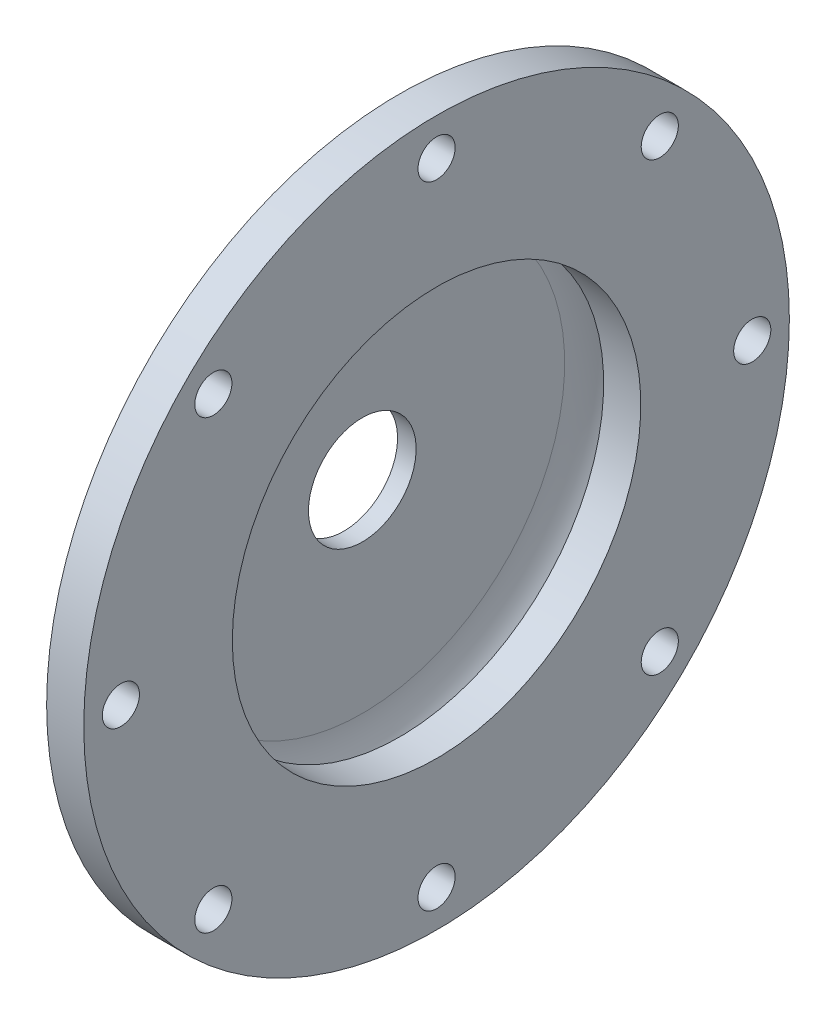
ISO-10303-21;
HEADER;
FILE_DESCRIPTION(('STEP AP214'),'2;1');
FILE_NAME('part.step','',(''),(''),'','','');
FILE_SCHEMA(('AUTOMOTIVE_DESIGN { 1 0 10303 214 1 1 1 1 }'));
ENDSEC;
DATA;
#1=APPLICATION_CONTEXT('core data for automotive mechanical design processes');
#2=APPLICATION_PROTOCOL_DEFINITION('international standard','automotive_design',2000,#1);
#3=PRODUCT_CONTEXT('',#1,'mechanical');
#4=PRODUCT('Part','Part','',(#3));
#5=PRODUCT_RELATED_PRODUCT_CATEGORY('part','',(#4));
#6=PRODUCT_DEFINITION_FORMATION('','',#4);
#7=PRODUCT_DEFINITION_CONTEXT('part definition',#1,'design');
#8=PRODUCT_DEFINITION('design','',#6,#7);
#9=PRODUCT_DEFINITION_SHAPE('','',#8);
#10=(LENGTH_UNIT() NAMED_UNIT(*) SI_UNIT(.MILLI.,.METRE.));
#11=(NAMED_UNIT(*) PLANE_ANGLE_UNIT() SI_UNIT($,.RADIAN.));
#12=(NAMED_UNIT(*) SI_UNIT($,.STERADIAN.) SOLID_ANGLE_UNIT());
#13=UNCERTAINTY_MEASURE_WITH_UNIT(LENGTH_MEASURE(1.E-05),#10,'distance_accuracy_value','');
#14=(GEOMETRIC_REPRESENTATION_CONTEXT(3) GLOBAL_UNCERTAINTY_ASSIGNED_CONTEXT((#13)) GLOBAL_UNIT_ASSIGNED_CONTEXT((#10,
#11,#12)) REPRESENTATION_CONTEXT('',''));
#15=CARTESIAN_POINT('',(0.,0.,0.));
#16=DIRECTION('',(0.,0.,1.));
#17=DIRECTION('',(1.,0.,0.));
#18=AXIS2_PLACEMENT_3D('',#15,#16,#17);
#19=CARTESIAN_POINT('',(4.13279166666667,0.,0.));
#20=DIRECTION('',(-1.,0.,0.));
#21=DIRECTION('',(0.,0.,1.));
#22=AXIS2_PLACEMENT_3D('',#19,#20,#21);
#23=TOROIDAL_SURFACE('',#22,34.6075,13.6577916666667);
#24=CARTESIAN_POINT('',(0.,0.,0.));
#25=DIRECTION('',(-1.,0.,0.));
#26=DIRECTION('',(0.,0.,1.));
#27=AXIS2_PLACEMENT_3D('',#24,#25,#26);
#28=CIRCLE('',#27,47.625);
#29=CARTESIAN_POINT('',(0.,0.,47.625));
#30=VERTEX_POINT('',#29);
#31=EDGE_CURVE('E93',#30,#30,#28,.T.);
#32=ORIENTED_EDGE('',*,*,#31,.T.);
#33=EDGE_LOOP('',(#32));
#34=FACE_BOUND('',#33,.T.);
#35=CARTESIAN_POINT('',(-9.52500000000001,0.,0.));
#36=DIRECTION('',(-1.,0.,0.));
#37=DIRECTION('',(0.,0.,1.));
#38=AXIS2_PLACEMENT_3D('',#35,#36,#37);
#39=CIRCLE('',#38,34.6075);
#40=CARTESIAN_POINT('',(-9.52500000000001,0.,34.6075));
#41=VERTEX_POINT('',#40);
#42=EDGE_CURVE('E10',#41,#41,#39,.T.);
#43=ORIENTED_EDGE('',*,*,#42,.F.);
#44=EDGE_LOOP('',(#43));
#45=FACE_BOUND('',#44,.T.);
#46=ADVANCED_FACE('F41',(#34,#45),#23,.T.);
#47=CARTESIAN_POINT('',(-9.525,0.,0.));
#48=DIRECTION('',(-1.,0.,0.));
#49=DIRECTION('',(0.,0.,1.));
#50=AXIS2_PLACEMENT_3D('',#47,#48,#49);
#51=PLANE('',#50);
#52=ORIENTED_EDGE('',*,*,#42,.T.);
#53=EDGE_LOOP('',(#52));
#54=FACE_BOUND('',#53,.T.);
#55=CARTESIAN_POINT('',(-9.52500000000001,0.,0.));
#56=DIRECTION('',(-1.,0.,0.));
#57=DIRECTION('',(0.,0.,1.));
#58=AXIS2_PLACEMENT_3D('',#55,#56,#57);
#59=CIRCLE('',#58,9.2075);
#60=CARTESIAN_POINT('',(-9.52500000000001,0.,9.2075));
#61=VERTEX_POINT('',#60);
#62=EDGE_CURVE('E49',#61,#61,#59,.T.);
#63=ORIENTED_EDGE('',*,*,#62,.F.);
#64=EDGE_LOOP('',(#63));
#65=FACE_BOUND('',#64,.T.);
#66=ADVANCED_FACE('F137',(#54,#65),#51,.T.);
#67=CARTESIAN_POINT('',(-978.52779400325,0.,0.));
#68=DIRECTION('',(-1.,0.,0.));
#69=DIRECTION('',(0.,0.,1.));
#70=AXIS2_PLACEMENT_3D('',#67,#68,#69);
#71=CYLINDRICAL_SURFACE('',#70,9.2075);
#72=ORIENTED_EDGE('',*,*,#62,.T.);
#73=EDGE_LOOP('',(#72));
#74=FACE_BOUND('',#73,.T.);
#75=CARTESIAN_POINT('',(-6.34999999999997,0.,0.));
#76=DIRECTION('',(-1.,0.,0.));
#77=DIRECTION('',(0.,0.,1.));
#78=AXIS2_PLACEMENT_3D('',#75,#76,#77);
#79=CIRCLE('',#78,9.2075);
#80=CARTESIAN_POINT('',(-6.34999999999997,0.,9.2075));
#81=VERTEX_POINT('',#80);
#82=EDGE_CURVE('E57',#81,#81,#79,.T.);
#83=ORIENTED_EDGE('',*,*,#82,.F.);
#84=EDGE_LOOP('',(#83));
#85=FACE_BOUND('',#84,.T.);
#86=ADVANCED_FACE('F135',(#74,#85),#71,.F.);
#87=CARTESIAN_POINT('',(-6.35,0.,0.));
#88=DIRECTION('',(1.,0.,0.));
#89=DIRECTION('',(0.,0.,-1.));
#90=AXIS2_PLACEMENT_3D('',#87,#88,#89);
#91=PLANE('',#90);
#92=ORIENTED_EDGE('',*,*,#82,.T.);
#93=EDGE_LOOP('',(#92));
#94=FACE_BOUND('',#93,.T.);
#95=CARTESIAN_POINT('',(-6.34999999999997,0.,0.));
#96=DIRECTION('',(-1.,0.,0.));
#97=DIRECTION('',(0.,0.,1.));
#98=AXIS2_PLACEMENT_3D('',#95,#96,#97);
#99=CIRCLE('',#98,34.6075);
#100=CARTESIAN_POINT('',(-6.34999999999997,0.,34.6075));
#101=VERTEX_POINT('',#100);
#102=EDGE_CURVE('E126',#101,#101,#99,.T.);
#103=ORIENTED_EDGE('',*,*,#102,.F.);
#104=EDGE_LOOP('',(#103));
#105=FACE_BOUND('',#104,.T.);
#106=ADVANCED_FACE('F132',(#94,#105),#91,.T.);
#107=CARTESIAN_POINT('',(4.45293750000002,0.,0.));
#108=DIRECTION('',(-1.,0.,0.));
#109=DIRECTION('',(0.,0.,1.));
#110=AXIS2_PLACEMENT_3D('',#107,#108,#109);
#111=TOROIDAL_SURFACE('',#110,34.6075,10.8029375);
#112=CARTESIAN_POINT('',(0.,0.,0.));
#113=DIRECTION('',(-1.,0.,0.));
#114=DIRECTION('',(0.,0.,1.));
#115=AXIS2_PLACEMENT_3D('',#112,#113,#114);
#116=CIRCLE('',#115,44.45);
#117=CARTESIAN_POINT('',(0.,0.,44.45));
#118=VERTEX_POINT('',#117);
#119=EDGE_CURVE('E123',#118,#118,#116,.T.);
#120=ORIENTED_EDGE('',*,*,#119,.F.);
#121=EDGE_LOOP('',(#120));
#122=FACE_BOUND('',#121,.T.);
#123=ORIENTED_EDGE('',*,*,#102,.T.);
#124=EDGE_LOOP('',(#123));
#125=FACE_BOUND('',#124,.T.);
#126=ADVANCED_FACE('F144',(#122,#125),#111,.F.);
#127=CARTESIAN_POINT('',(0.,0.,0.));
#128=DIRECTION('',(-1.,0.,0.));
#129=DIRECTION('',(0.,0.,1.));
#130=AXIS2_PLACEMENT_3D('',#127,#128,#129);
#131=PLANE('',#130);
#132=ORIENTED_EDGE('',*,*,#119,.T.);
#133=EDGE_LOOP('',(#132));
#134=FACE_BOUND('',#133,.T.);
#135=CARTESIAN_POINT('',(0.,0.,0.));
#136=DIRECTION('',(-1.,0.,0.));
#137=DIRECTION('',(0.,0.,1.));
#138=AXIS2_PLACEMENT_3D('',#135,#136,#137);
#139=CIRCLE('',#138,34.925);
#140=CARTESIAN_POINT('',(0.,0.,34.925));
#141=VERTEX_POINT('',#140);
#142=EDGE_CURVE('E119',#141,#141,#139,.T.);
#143=ORIENTED_EDGE('',*,*,#142,.F.);
#144=EDGE_LOOP('',(#143));
#145=FACE_BOUND('',#144,.T.);
#146=ADVANCED_FACE('F170',(#134,#145),#131,.T.);
#147=CARTESIAN_POINT('',(-978.52779400325,0.,0.));
#148=DIRECTION('',(-1.,0.,0.));
#149=DIRECTION('',(0.,0.,1.));
#150=AXIS2_PLACEMENT_3D('',#147,#148,#149);
#151=CYLINDRICAL_SURFACE('',#150,34.925);
#152=CARTESIAN_POINT('',(6.34999999999997,0.,0.));
#153=DIRECTION('',(-1.,0.,0.));
#154=DIRECTION('',(0.,0.,1.));
#155=AXIS2_PLACEMENT_3D('',#152,#153,#154);
#156=CIRCLE('',#155,34.925);
#157=CARTESIAN_POINT('',(6.34999999999997,0.,34.925));
#158=VERTEX_POINT('',#157);
#159=EDGE_CURVE('E115',#158,#158,#156,.T.);
#160=ORIENTED_EDGE('',*,*,#159,.F.);
#161=EDGE_LOOP('',(#160));
#162=FACE_BOUND('',#161,.T.);
#163=ORIENTED_EDGE('',*,*,#142,.T.);
#164=EDGE_LOOP('',(#163));
#165=FACE_BOUND('',#164,.T.);
#166=ADVANCED_FACE('F181',(#162,#165),#151,.F.);
#167=CARTESIAN_POINT('',(6.35,0.,0.));
#168=DIRECTION('',(-1.,0.,0.));
#169=DIRECTION('',(0.,0.,1.));
#170=AXIS2_PLACEMENT_3D('',#167,#168,#169);
#171=PLANE('',#170);
#172=CARTESIAN_POINT('',(6.34999999999997,53.975,0.));
#173=DIRECTION('',(-1.,0.,0.));
#174=DIRECTION('',(0.,0.,1.));
#175=AXIS2_PLACEMENT_3D('',#172,#173,#174);
#176=CIRCLE('',#175,3.175);
#177=CARTESIAN_POINT('',(6.34999999999997,53.975,3.175));
#178=VERTEX_POINT('',#177);
#179=EDGE_CURVE('E66',#178,#178,#176,.T.);
#180=ORIENTED_EDGE('',*,*,#179,.T.);
#181=EDGE_LOOP('',(#180));
#182=FACE_BOUND('',#181,.T.);
#183=CARTESIAN_POINT('',(6.34999999999997,38.1660885145439,38.1660885145439));
#184=DIRECTION('',(-1.,0.,0.));
#185=DIRECTION('',(0.,0.,1.));
#186=AXIS2_PLACEMENT_3D('',#183,#184,#185);
#187=CIRCLE('',#186,3.17500000000137);
#188=CARTESIAN_POINT('',(6.34999999999997,38.1660885145439,41.3410885145453));
#189=VERTEX_POINT('',#188);
#190=EDGE_CURVE('E329',#189,#189,#187,.T.);
#191=ORIENTED_EDGE('',*,*,#190,.T.);
#192=EDGE_LOOP('',(#191));
#193=FACE_BOUND('',#192,.T.);
#194=CARTESIAN_POINT('',(6.34999999999997,0.,53.975));
#195=DIRECTION('',(-1.,0.,0.));
#196=DIRECTION('',(0.,0.,1.));
#197=AXIS2_PLACEMENT_3D('',#194,#195,#196);
#198=CIRCLE('',#197,3.17500000000286);
#199=CARTESIAN_POINT('',(6.34999999999997,0.,57.1500000000029));
#200=VERTEX_POINT('',#199);
#201=EDGE_CURVE('E332',#200,#200,#198,.T.);
#202=ORIENTED_EDGE('',*,*,#201,.T.);
#203=EDGE_LOOP('',(#202));
#204=FACE_BOUND('',#203,.T.);
#205=CARTESIAN_POINT('',(6.34999999999997,-38.1660885145439,38.1660885145439));
#206=DIRECTION('',(-1.,0.,0.));
#207=DIRECTION('',(0.,0.,1.));
#208=AXIS2_PLACEMENT_3D('',#205,#206,#207);
#209=CIRCLE('',#208,3.17500000000421);
#210=CARTESIAN_POINT('',(6.34999999999997,-38.1660885145439,41.3410885145481));
#211=VERTEX_POINT('',#210);
#212=EDGE_CURVE('E338',#211,#211,#209,.T.);
#213=ORIENTED_EDGE('',*,*,#212,.T.);
#214=EDGE_LOOP('',(#213));
#215=FACE_BOUND('',#214,.T.);
#216=CARTESIAN_POINT('',(6.34999999999997,-53.975,0.));
#217=DIRECTION('',(-1.,0.,0.));
#218=DIRECTION('',(0.,0.,1.));
#219=AXIS2_PLACEMENT_3D('',#216,#217,#218);
#220=CIRCLE('',#219,3.17500000000437);
#221=CARTESIAN_POINT('',(6.34999999999997,-53.975,3.17500000000438));
#222=VERTEX_POINT('',#221);
#223=EDGE_CURVE('E342',#222,#222,#220,.T.);
#224=ORIENTED_EDGE('',*,*,#223,.T.);
#225=EDGE_LOOP('',(#224));
#226=FACE_BOUND('',#225,.T.);
#227=CARTESIAN_POINT('',(6.34999999999997,-38.1660885145439,-38.1660885145439));
#228=DIRECTION('',(-1.,0.,0.));
#229=DIRECTION('',(0.,0.,1.));
#230=AXIS2_PLACEMENT_3D('',#227,#228,#229);
#231=CIRCLE('',#230,3.17500000000326);
#232=CARTESIAN_POINT('',(6.34999999999997,-38.1660885145439,-34.9910885145407));
#233=VERTEX_POINT('',#232);
#234=EDGE_CURVE('E346',#233,#233,#231,.T.);
#235=ORIENTED_EDGE('',*,*,#234,.T.);
#236=EDGE_LOOP('',(#235));
#237=FACE_BOUND('',#236,.T.);
#238=CARTESIAN_POINT('',(6.34999999999997,0.,-53.975));
#239=DIRECTION('',(-1.,0.,0.));
#240=DIRECTION('',(0.,0.,1.));
#241=AXIS2_PLACEMENT_3D('',#238,#239,#240);
#242=CIRCLE('',#241,3.17500000000152);
#243=CARTESIAN_POINT('',(6.34999999999997,0.,-50.7999999999985));
#244=VERTEX_POINT('',#243);
#245=EDGE_CURVE('E349',#244,#244,#242,.T.);
#246=ORIENTED_EDGE('',*,*,#245,.T.);
#247=EDGE_LOOP('',(#246));
#248=FACE_BOUND('',#247,.T.);
#249=CARTESIAN_POINT('',(6.34999999999997,38.1660885145439,-38.1660885145439));
#250=DIRECTION('',(-1.,0.,0.));
#251=DIRECTION('',(0.,0.,1.));
#252=AXIS2_PLACEMENT_3D('',#249,#250,#251);
#253=CIRCLE('',#252,3.17500000000017);
#254=CARTESIAN_POINT('',(6.34999999999997,38.1660885145439,-34.9910885145438));
#255=VERTEX_POINT('',#254);
#256=EDGE_CURVE('E110',#255,#255,#253,.T.);
#257=ORIENTED_EDGE('',*,*,#256,.T.);
#258=EDGE_LOOP('',(#257));
#259=FACE_BOUND('',#258,.T.);
#260=CARTESIAN_POINT('',(6.34999999999997,0.,0.));
#261=DIRECTION('',(-1.,0.,0.));
#262=DIRECTION('',(0.,0.,1.));
#263=AXIS2_PLACEMENT_3D('',#260,#261,#262);
#264=CIRCLE('',#263,60.325);
#265=CARTESIAN_POINT('',(6.34999999999997,0.,60.325));
#266=VERTEX_POINT('',#265);
#267=EDGE_CURVE('E107',#266,#266,#264,.T.);
#268=ORIENTED_EDGE('',*,*,#267,.F.);
#269=EDGE_LOOP('',(#268));
#270=FACE_BOUND('',#269,.T.);
#271=ORIENTED_EDGE('',*,*,#159,.T.);
#272=EDGE_LOOP('',(#271));
#273=FACE_BOUND('',#272,.T.);
#274=ADVANCED_FACE('F178',(#182,#193,#204,#215,#226,#237,#248,#259,#270,#273),#171,.F.);
#275=CARTESIAN_POINT('',(-978.52779400325,0.,0.));
#276=DIRECTION('',(-1.,0.,0.));
#277=DIRECTION('',(0.,0.,1.));
#278=AXIS2_PLACEMENT_3D('',#275,#276,#277);
#279=CYLINDRICAL_SURFACE('',#278,60.325);
#280=ORIENTED_EDGE('',*,*,#267,.T.);
#281=EDGE_LOOP('',(#280));
#282=FACE_BOUND('',#281,.T.);
#283=CARTESIAN_POINT('',(0.,0.,0.));
#284=DIRECTION('',(-1.,0.,0.));
#285=DIRECTION('',(0.,0.,1.));
#286=AXIS2_PLACEMENT_3D('',#283,#284,#285);
#287=CIRCLE('',#286,60.325);
#288=CARTESIAN_POINT('',(0.,0.,60.325));
#289=VERTEX_POINT('',#288);
#290=EDGE_CURVE('E100',#289,#289,#287,.T.);
#291=ORIENTED_EDGE('',*,*,#290,.F.);
#292=EDGE_LOOP('',(#291));
#293=FACE_BOUND('',#292,.T.);
#294=ADVANCED_FACE('F167',(#282,#293),#279,.T.);
#295=CARTESIAN_POINT('',(0.,53.975,0.));
#296=DIRECTION('',(-1.,0.,0.));
#297=DIRECTION('',(0.,0.,1.));
#298=AXIS2_PLACEMENT_3D('',#295,#296,#297);
#299=CIRCLE('',#298,3.175);
#300=CARTESIAN_POINT('',(0.,53.975,3.175));
#301=VERTEX_POINT('',#300);
#302=EDGE_CURVE('E44',#301,#301,#299,.T.);
#303=ORIENTED_EDGE('',*,*,#302,.F.);
#304=EDGE_LOOP('',(#303));
#305=FACE_BOUND('',#304,.T.);
#306=CARTESIAN_POINT('',(0.,38.1660885145439,38.1660885145439));
#307=DIRECTION('',(-1.,0.,0.));
#308=DIRECTION('',(0.,0.,1.));
#309=AXIS2_PLACEMENT_3D('',#306,#307,#308);
#310=CIRCLE('',#309,3.17500000000137);
#311=CARTESIAN_POINT('',(0.,38.1660885145439,41.3410885145453));
#312=VERTEX_POINT('',#311);
#313=EDGE_CURVE('E84',#312,#312,#310,.T.);
#314=ORIENTED_EDGE('',*,*,#313,.F.);
#315=EDGE_LOOP('',(#314));
#316=FACE_BOUND('',#315,.T.);
#317=CARTESIAN_POINT('',(0.,0.,53.975));
#318=DIRECTION('',(-1.,0.,0.));
#319=DIRECTION('',(0.,0.,1.));
#320=AXIS2_PLACEMENT_3D('',#317,#318,#319);
#321=CIRCLE('',#320,3.17500000000286);
#322=CARTESIAN_POINT('',(0.,0.,57.1500000000029));
#323=VERTEX_POINT('',#322);
#324=EDGE_CURVE('E82',#323,#323,#321,.T.);
#325=ORIENTED_EDGE('',*,*,#324,.F.);
#326=EDGE_LOOP('',(#325));
#327=FACE_BOUND('',#326,.T.);
#328=CARTESIAN_POINT('',(0.,-38.1660885145439,38.1660885145439));
#329=DIRECTION('',(-1.,0.,0.));
#330=DIRECTION('',(0.,0.,1.));
#331=AXIS2_PLACEMENT_3D('',#328,#329,#330);
#332=CIRCLE('',#331,3.17500000000421);
#333=CARTESIAN_POINT('',(0.,-38.1660885145439,41.3410885145481));
#334=VERTEX_POINT('',#333);
#335=EDGE_CURVE('E78',#334,#334,#332,.T.);
#336=ORIENTED_EDGE('',*,*,#335,.F.);
#337=EDGE_LOOP('',(#336));
#338=FACE_BOUND('',#337,.T.);
#339=CARTESIAN_POINT('',(0.,-53.975,0.));
#340=DIRECTION('',(-1.,0.,0.));
#341=DIRECTION('',(0.,0.,1.));
#342=AXIS2_PLACEMENT_3D('',#339,#340,#341);
#343=CIRCLE('',#342,3.17500000000437);
#344=CARTESIAN_POINT('',(0.,-53.975,3.17500000000438));
#345=VERTEX_POINT('',#344);
#346=EDGE_CURVE('E74',#345,#345,#343,.T.);
#347=ORIENTED_EDGE('',*,*,#346,.F.);
#348=EDGE_LOOP('',(#347));
#349=FACE_BOUND('',#348,.T.);
#350=CARTESIAN_POINT('',(0.,-38.1660885145439,-38.1660885145439));
#351=DIRECTION('',(-1.,0.,0.));
#352=DIRECTION('',(0.,0.,1.));
#353=AXIS2_PLACEMENT_3D('',#350,#351,#352);
#354=CIRCLE('',#353,3.17500000000326);
#355=CARTESIAN_POINT('',(0.,-38.1660885145439,-34.9910885145407));
#356=VERTEX_POINT('',#355);
#357=EDGE_CURVE('E70',#356,#356,#354,.T.);
#358=ORIENTED_EDGE('',*,*,#357,.F.);
#359=EDGE_LOOP('',(#358));
#360=FACE_BOUND('',#359,.T.);
#361=CARTESIAN_POINT('',(0.,0.,-53.975));
#362=DIRECTION('',(-1.,0.,0.));
#363=DIRECTION('',(0.,0.,1.));
#364=AXIS2_PLACEMENT_3D('',#361,#362,#363);
#365=CIRCLE('',#364,3.17500000000152);
#366=CARTESIAN_POINT('',(0.,0.,-50.7999999999985));
#367=VERTEX_POINT('',#366);
#368=EDGE_CURVE('E65',#367,#367,#365,.T.);
#369=ORIENTED_EDGE('',*,*,#368,.F.);
#370=EDGE_LOOP('',(#369));
#371=FACE_BOUND('',#370,.T.);
#372=CARTESIAN_POINT('',(0.,38.1660885145439,-38.1660885145439));
#373=DIRECTION('',(-1.,0.,0.));
#374=DIRECTION('',(0.,0.,1.));
#375=AXIS2_PLACEMENT_3D('',#372,#373,#374);
#376=CIRCLE('',#375,3.17500000000017);
#377=CARTESIAN_POINT('',(0.,38.1660885145439,-34.9910885145438));
#378=VERTEX_POINT('',#377);
#379=EDGE_CURVE('E61',#378,#378,#376,.T.);
#380=ORIENTED_EDGE('',*,*,#379,.F.);
#381=EDGE_LOOP('',(#380));
#382=FACE_BOUND('',#381,.T.);
#383=ORIENTED_EDGE('',*,*,#290,.T.);
#384=EDGE_LOOP('',(#383));
#385=FACE_BOUND('',#384,.T.);
#386=ORIENTED_EDGE('',*,*,#31,.F.);
#387=EDGE_LOOP('',(#386));
#388=FACE_BOUND('',#387,.T.);
#389=ADVANCED_FACE('F162',(#305,#316,#327,#338,#349,#360,#371,#382,#385,#388),#131,.T.);
#390=CARTESIAN_POINT('',(6.34999999999997,38.1660885145439,-38.1660885145439));
#391=DIRECTION('',(-1.,0.,0.));
#392=DIRECTION('',(0.,0.,1.));
#393=AXIS2_PLACEMENT_3D('',#390,#391,#392);
#394=CYLINDRICAL_SURFACE('',#393,3.17500000000017);
#395=ORIENTED_EDGE('',*,*,#379,.T.);
#396=EDGE_LOOP('',(#395));
#397=FACE_BOUND('',#396,.T.);
#398=ORIENTED_EDGE('',*,*,#256,.F.);
#399=EDGE_LOOP('',(#398));
#400=FACE_BOUND('',#399,.T.);
#401=ADVANCED_FACE('F166',(#397,#400),#394,.F.);
#402=CARTESIAN_POINT('',(6.34999999999997,0.,-53.975));
#403=DIRECTION('',(-1.,0.,0.));
#404=DIRECTION('',(0.,0.,1.));
#405=AXIS2_PLACEMENT_3D('',#402,#403,#404);
#406=CYLINDRICAL_SURFACE('',#405,3.17500000000152);
#407=ORIENTED_EDGE('',*,*,#368,.T.);
#408=EDGE_LOOP('',(#407));
#409=FACE_BOUND('',#408,.T.);
#410=ORIENTED_EDGE('',*,*,#245,.F.);
#411=EDGE_LOOP('',(#410));
#412=FACE_BOUND('',#411,.T.);
#413=ADVANCED_FACE('F212',(#409,#412),#406,.F.);
#414=CARTESIAN_POINT('',(6.34999999999997,-38.1660885145439,-38.1660885145439));
#415=DIRECTION('',(-1.,0.,0.));
#416=DIRECTION('',(0.,0.,1.));
#417=AXIS2_PLACEMENT_3D('',#414,#415,#416);
#418=CYLINDRICAL_SURFACE('',#417,3.17500000000326);
#419=ORIENTED_EDGE('',*,*,#357,.T.);
#420=EDGE_LOOP('',(#419));
#421=FACE_BOUND('',#420,.T.);
#422=ORIENTED_EDGE('',*,*,#234,.F.);
#423=EDGE_LOOP('',(#422));
#424=FACE_BOUND('',#423,.T.);
#425=ADVANCED_FACE('F222',(#421,#424),#418,.F.);
#426=CARTESIAN_POINT('',(6.34999999999997,-53.975,0.));
#427=DIRECTION('',(-1.,0.,0.));
#428=DIRECTION('',(0.,0.,1.));
#429=AXIS2_PLACEMENT_3D('',#426,#427,#428);
#430=CYLINDRICAL_SURFACE('',#429,3.17500000000437);
#431=ORIENTED_EDGE('',*,*,#346,.T.);
#432=EDGE_LOOP('',(#431));
#433=FACE_BOUND('',#432,.T.);
#434=ORIENTED_EDGE('',*,*,#223,.F.);
#435=EDGE_LOOP('',(#434));
#436=FACE_BOUND('',#435,.T.);
#437=ADVANCED_FACE('F232',(#433,#436),#430,.F.);
#438=CARTESIAN_POINT('',(6.34999999999997,-38.1660885145439,38.1660885145439));
#439=DIRECTION('',(-1.,0.,0.));
#440=DIRECTION('',(0.,0.,1.));
#441=AXIS2_PLACEMENT_3D('',#438,#439,#440);
#442=CYLINDRICAL_SURFACE('',#441,3.17500000000421);
#443=ORIENTED_EDGE('',*,*,#335,.T.);
#444=EDGE_LOOP('',(#443));
#445=FACE_BOUND('',#444,.T.);
#446=ORIENTED_EDGE('',*,*,#212,.F.);
#447=EDGE_LOOP('',(#446));
#448=FACE_BOUND('',#447,.T.);
#449=ADVANCED_FACE('F241',(#445,#448),#442,.F.);
#450=CARTESIAN_POINT('',(6.34999999999997,0.,53.975));
#451=DIRECTION('',(-1.,0.,0.));
#452=DIRECTION('',(0.,0.,1.));
#453=AXIS2_PLACEMENT_3D('',#450,#451,#452);
#454=CYLINDRICAL_SURFACE('',#453,3.17500000000286);
#455=ORIENTED_EDGE('',*,*,#324,.T.);
#456=EDGE_LOOP('',(#455));
#457=FACE_BOUND('',#456,.T.);
#458=ORIENTED_EDGE('',*,*,#201,.F.);
#459=EDGE_LOOP('',(#458));
#460=FACE_BOUND('',#459,.T.);
#461=ADVANCED_FACE('F250',(#457,#460),#454,.F.);
#462=CARTESIAN_POINT('',(6.34999999999997,38.1660885145439,38.1660885145439));
#463=DIRECTION('',(-1.,0.,0.));
#464=DIRECTION('',(0.,0.,1.));
#465=AXIS2_PLACEMENT_3D('',#462,#463,#464);
#466=CYLINDRICAL_SURFACE('',#465,3.17500000000137);
#467=ORIENTED_EDGE('',*,*,#313,.T.);
#468=EDGE_LOOP('',(#467));
#469=FACE_BOUND('',#468,.T.);
#470=ORIENTED_EDGE('',*,*,#190,.F.);
#471=EDGE_LOOP('',(#470));
#472=FACE_BOUND('',#471,.T.);
#473=ADVANCED_FACE('F259',(#469,#472),#466,.F.);
#474=CARTESIAN_POINT('',(6.34999999999997,53.975,0.));
#475=DIRECTION('',(-1.,0.,0.));
#476=DIRECTION('',(0.,0.,1.));
#477=AXIS2_PLACEMENT_3D('',#474,#475,#476);
#478=CYLINDRICAL_SURFACE('',#477,3.175);
#479=ORIENTED_EDGE('',*,*,#302,.T.);
#480=EDGE_LOOP('',(#479));
#481=FACE_BOUND('',#480,.T.);
#482=ORIENTED_EDGE('',*,*,#179,.F.);
#483=EDGE_LOOP('',(#482));
#484=FACE_BOUND('',#483,.T.);
#485=ADVANCED_FACE('F268',(#481,#484),#478,.F.);
#486=CLOSED_SHELL('',(#46,#66,#86,#106,#126,#146,#166,#274,#294,#389,#401,#413,#425,#437,#449,
#461,#473,#485));
#487=MANIFOLD_SOLID_BREP('B2',#486);
#488=ADVANCED_BREP_SHAPE_REPRESENTATION('',(#18,#487),#14);
#489=SHAPE_DEFINITION_REPRESENTATION(#9,#488);
ENDSEC;
END-ISO-10303-21;
